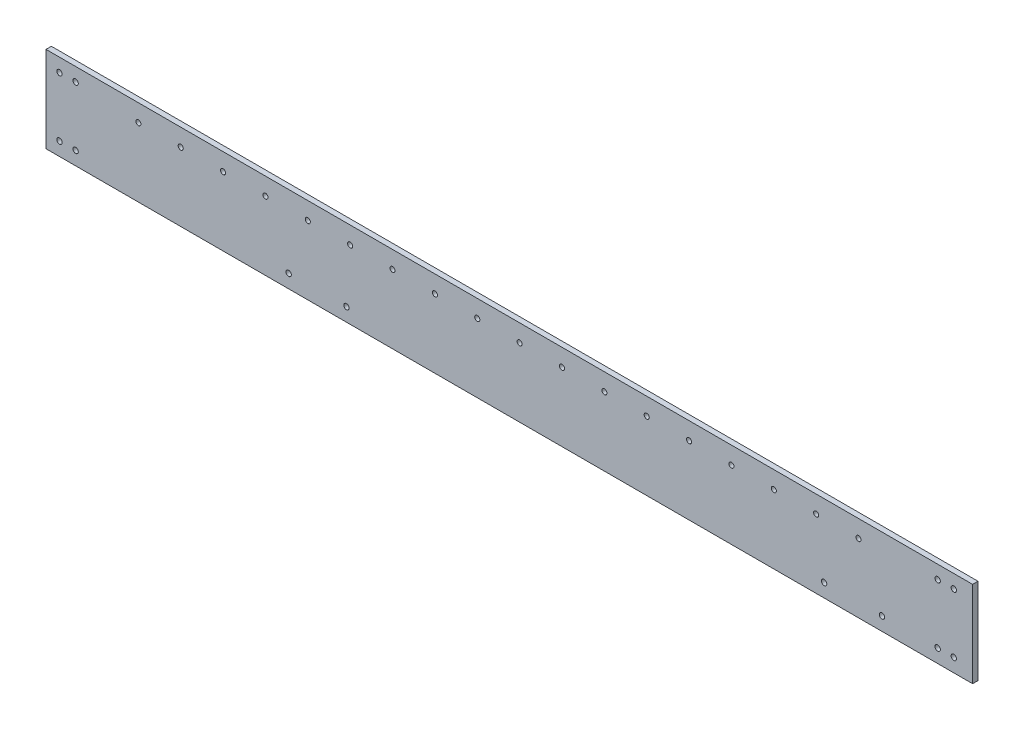
ISO-10303-21;
HEADER;
FILE_DESCRIPTION(('STEP AP214'),'2;1');
FILE_NAME('part.step','',(''),(''),'','','');
FILE_SCHEMA(('AUTOMOTIVE_DESIGN { 1 0 10303 214 1 1 1 1 }'));
ENDSEC;
DATA;
#1=APPLICATION_CONTEXT('core data for automotive mechanical design processes');
#2=APPLICATION_PROTOCOL_DEFINITION('international standard','automotive_design',2000,#1);
#3=PRODUCT_CONTEXT('',#1,'mechanical');
#4=PRODUCT('Part','Part','',(#3));
#5=PRODUCT_RELATED_PRODUCT_CATEGORY('part','',(#4));
#6=PRODUCT_DEFINITION_FORMATION('','',#4);
#7=PRODUCT_DEFINITION_CONTEXT('part definition',#1,'design');
#8=PRODUCT_DEFINITION('design','',#6,#7);
#9=PRODUCT_DEFINITION_SHAPE('','',#8);
#10=(LENGTH_UNIT() NAMED_UNIT(*) SI_UNIT(.MILLI.,.METRE.));
#11=(NAMED_UNIT(*) PLANE_ANGLE_UNIT() SI_UNIT($,.RADIAN.));
#12=(NAMED_UNIT(*) SI_UNIT($,.STERADIAN.) SOLID_ANGLE_UNIT());
#13=UNCERTAINTY_MEASURE_WITH_UNIT(LENGTH_MEASURE(1.E-05),#10,'distance_accuracy_value','');
#14=(GEOMETRIC_REPRESENTATION_CONTEXT(3) GLOBAL_UNCERTAINTY_ASSIGNED_CONTEXT((#13)) GLOBAL_UNIT_ASSIGNED_CONTEXT((#10,
#11,#12)) REPRESENTATION_CONTEXT('',''));
#15=CARTESIAN_POINT('',(0.,0.,0.));
#16=DIRECTION('',(0.,0.,1.));
#17=DIRECTION('',(1.,0.,0.));
#18=AXIS2_PLACEMENT_3D('',#15,#16,#17);
#19=CARTESIAN_POINT('',(546.825,50.8,0.));
#20=DIRECTION('',(0.,0.,1.));
#21=DIRECTION('',(0.,-1.,0.));
#22=AXIS2_PLACEMENT_3D('',#19,#20,#21);
#23=PLANE('',#22);
#24=CARTESIAN_POINT('',(254.5,40.575,0.));
#25=DIRECTION('',(0.,0.,1.));
#26=DIRECTION('',(1.,0.,0.));
#27=AXIS2_PLACEMENT_3D('',#24,#25,#26);
#28=CIRCLE('',#27,1.50000000000002);
#29=CARTESIAN_POINT('',(256.,40.575,0.));
#30=VERTEX_POINT('',#29);
#31=EDGE_CURVE('E167',#30,#30,#28,.T.);
#32=ORIENTED_EDGE('',*,*,#31,.T.);
#33=EDGE_LOOP('',(#32));
#34=FACE_BOUND('',#33,.T.);
#35=CARTESIAN_POINT('',(229.5,40.575,0.));
#36=DIRECTION('',(0.,0.,1.));
#37=DIRECTION('',(1.,0.,0.));
#38=AXIS2_PLACEMENT_3D('',#35,#36,#37);
#39=CIRCLE('',#38,1.5);
#40=CARTESIAN_POINT('',(231.,40.575,0.));
#41=VERTEX_POINT('',#40);
#42=EDGE_CURVE('E174',#41,#41,#39,.T.);
#43=ORIENTED_EDGE('',*,*,#42,.T.);
#44=EDGE_LOOP('',(#43));
#45=FACE_BOUND('',#44,.T.);
#46=CARTESIAN_POINT('',(204.5,40.575,0.));
#47=DIRECTION('',(0.,0.,1.));
#48=DIRECTION('',(1.,0.,0.));
#49=AXIS2_PLACEMENT_3D('',#46,#47,#48);
#50=CIRCLE('',#49,1.5);
#51=CARTESIAN_POINT('',(206.,40.575,0.));
#52=VERTEX_POINT('',#51);
#53=EDGE_CURVE('E180',#52,#52,#50,.T.);
#54=ORIENTED_EDGE('',*,*,#53,.T.);
#55=EDGE_LOOP('',(#54));
#56=FACE_BOUND('',#55,.T.);
#57=CARTESIAN_POINT('',(179.5,40.575,0.));
#58=DIRECTION('',(0.,0.,1.));
#59=DIRECTION('',(1.,0.,0.));
#60=AXIS2_PLACEMENT_3D('',#57,#58,#59);
#61=CIRCLE('',#60,1.5);
#62=CARTESIAN_POINT('',(181.,40.575,0.));
#63=VERTEX_POINT('',#62);
#64=EDGE_CURVE('E186',#63,#63,#61,.T.);
#65=ORIENTED_EDGE('',*,*,#64,.T.);
#66=EDGE_LOOP('',(#65));
#67=FACE_BOUND('',#66,.T.);
#68=CARTESIAN_POINT('',(154.5,40.575,0.));
#69=DIRECTION('',(0.,0.,1.));
#70=DIRECTION('',(1.,0.,0.));
#71=AXIS2_PLACEMENT_3D('',#68,#69,#70);
#72=CIRCLE('',#71,1.5);
#73=CARTESIAN_POINT('',(156.,40.575,0.));
#74=VERTEX_POINT('',#73);
#75=EDGE_CURVE('E192',#74,#74,#72,.T.);
#76=ORIENTED_EDGE('',*,*,#75,.T.);
#77=EDGE_LOOP('',(#76));
#78=FACE_BOUND('',#77,.T.);
#79=CARTESIAN_POINT('',(129.5,40.575,0.));
#80=DIRECTION('',(0.,0.,1.));
#81=DIRECTION('',(1.,0.,0.));
#82=AXIS2_PLACEMENT_3D('',#79,#80,#81);
#83=CIRCLE('',#82,1.5);
#84=CARTESIAN_POINT('',(131.,40.575,0.));
#85=VERTEX_POINT('',#84);
#86=EDGE_CURVE('E198',#85,#85,#83,.T.);
#87=ORIENTED_EDGE('',*,*,#86,.T.);
#88=EDGE_LOOP('',(#87));
#89=FACE_BOUND('',#88,.T.);
#90=CARTESIAN_POINT('',(104.5,40.575,0.));
#91=DIRECTION('',(0.,0.,1.));
#92=DIRECTION('',(1.,0.,0.));
#93=AXIS2_PLACEMENT_3D('',#90,#91,#92);
#94=CIRCLE('',#93,1.50000000000001);
#95=CARTESIAN_POINT('',(106.,40.575,0.));
#96=VERTEX_POINT('',#95);
#97=EDGE_CURVE('E204',#96,#96,#94,.T.);
#98=ORIENTED_EDGE('',*,*,#97,.T.);
#99=EDGE_LOOP('',(#98));
#100=FACE_BOUND('',#99,.T.);
#101=CARTESIAN_POINT('',(79.5,40.575,0.));
#102=DIRECTION('',(0.,0.,1.));
#103=DIRECTION('',(1.,0.,0.));
#104=AXIS2_PLACEMENT_3D('',#101,#102,#103);
#105=CIRCLE('',#104,1.5);
#106=CARTESIAN_POINT('',(81.,40.575,0.));
#107=VERTEX_POINT('',#106);
#108=EDGE_CURVE('E210',#107,#107,#105,.T.);
#109=ORIENTED_EDGE('',*,*,#108,.T.);
#110=EDGE_LOOP('',(#109));
#111=FACE_BOUND('',#110,.T.);
#112=CARTESIAN_POINT('',(535.7125,42.8625,0.));
#113=DIRECTION('',(0.,0.,1.));
#114=DIRECTION('',(1.,0.,0.));
#115=AXIS2_PLACEMENT_3D('',#112,#113,#114);
#116=CIRCLE('',#115,1.58750000000004);
#117=CARTESIAN_POINT('',(537.3,42.8625,0.));
#118=VERTEX_POINT('',#117);
#119=EDGE_CURVE('E138',#118,#118,#116,.T.);
#120=ORIENTED_EDGE('',*,*,#119,.T.);
#121=EDGE_LOOP('',(#120));
#122=FACE_BOUND('',#121,.T.);
#123=CARTESIAN_POINT('',(526.1875,42.8625,0.));
#124=DIRECTION('',(0.,0.,1.));
#125=DIRECTION('',(1.,0.,0.));
#126=AXIS2_PLACEMENT_3D('',#123,#124,#125);
#127=CIRCLE('',#126,1.58750000000004);
#128=CARTESIAN_POINT('',(527.775,42.8625,0.));
#129=VERTEX_POINT('',#128);
#130=EDGE_CURVE('E132',#129,#129,#127,.T.);
#131=ORIENTED_EDGE('',*,*,#130,.T.);
#132=EDGE_LOOP('',(#131));
#133=FACE_BOUND('',#132,.T.);
#134=CARTESIAN_POINT('',(17.4625,42.8625,0.));
#135=DIRECTION('',(0.,0.,1.));
#136=DIRECTION('',(1.,0.,0.));
#137=AXIS2_PLACEMENT_3D('',#134,#135,#136);
#138=CIRCLE('',#137,1.5875);
#139=CARTESIAN_POINT('',(19.05,42.8625,0.));
#140=VERTEX_POINT('',#139);
#141=EDGE_CURVE('E126',#140,#140,#138,.T.);
#142=ORIENTED_EDGE('',*,*,#141,.T.);
#143=EDGE_LOOP('',(#142));
#144=FACE_BOUND('',#143,.T.);
#145=CARTESIAN_POINT('',(7.93750000000004,7.9375,0.));
#146=DIRECTION('',(0.,0.,1.));
#147=DIRECTION('',(1.,0.,0.));
#148=AXIS2_PLACEMENT_3D('',#145,#146,#147);
#149=CIRCLE('',#148,1.5875);
#150=CARTESIAN_POINT('',(9.52500000000004,7.9375,0.));
#151=VERTEX_POINT('',#150);
#152=EDGE_CURVE('E119',#151,#151,#149,.T.);
#153=ORIENTED_EDGE('',*,*,#152,.T.);
#154=EDGE_LOOP('',(#153));
#155=FACE_BOUND('',#154,.T.);
#156=CARTESIAN_POINT('',(54.5,40.575,0.));
#157=DIRECTION('',(0.,0.,1.));
#158=DIRECTION('',(1.,0.,0.));
#159=AXIS2_PLACEMENT_3D('',#156,#157,#158);
#160=CIRCLE('',#159,1.5);
#161=CARTESIAN_POINT('',(56.,40.575,0.));
#162=VERTEX_POINT('',#161);
#163=EDGE_CURVE('E155',#162,#162,#160,.T.);
#164=ORIENTED_EDGE('',*,*,#163,.T.);
#165=EDGE_LOOP('',(#164));
#166=FACE_BOUND('',#165,.T.);
#167=CARTESIAN_POINT('',(535.7125,7.9375,0.));
#168=DIRECTION('',(0.,0.,1.));
#169=DIRECTION('',(1.,0.,0.));
#170=AXIS2_PLACEMENT_3D('',#167,#168,#169);
#171=CIRCLE('',#170,1.58750000000005);
#172=CARTESIAN_POINT('',(537.3,7.9375,0.));
#173=VERTEX_POINT('',#172);
#174=EDGE_CURVE('E162',#173,#173,#171,.T.);
#175=ORIENTED_EDGE('',*,*,#174,.T.);
#176=EDGE_LOOP('',(#175));
#177=FACE_BOUND('',#176,.T.);
#178=CARTESIAN_POINT('',(526.1875,7.9375,0.));
#179=DIRECTION('',(0.,0.,1.));
#180=DIRECTION('',(1.,0.,0.));
#181=AXIS2_PLACEMENT_3D('',#178,#179,#180);
#182=CIRCLE('',#181,1.58750000000005);
#183=CARTESIAN_POINT('',(527.775,7.9375,0.));
#184=VERTEX_POINT('',#183);
#185=EDGE_CURVE('E143',#184,#184,#182,.T.);
#186=ORIENTED_EDGE('',*,*,#185,.T.);
#187=EDGE_LOOP('',(#186));
#188=FACE_BOUND('',#187,.T.);
#189=CARTESIAN_POINT('',(17.4625,7.9375,0.));
#190=DIRECTION('',(0.,0.,1.));
#191=DIRECTION('',(1.,0.,0.));
#192=AXIS2_PLACEMENT_3D('',#189,#190,#191);
#193=CIRCLE('',#192,1.5875);
#194=CARTESIAN_POINT('',(19.05,7.9375,0.));
#195=VERTEX_POINT('',#194);
#196=EDGE_CURVE('E150',#195,#195,#193,.T.);
#197=ORIENTED_EDGE('',*,*,#196,.T.);
#198=EDGE_LOOP('',(#197));
#199=FACE_BOUND('',#198,.T.);
#200=CARTESIAN_POINT('',(143.1875,7.9375,0.));
#201=DIRECTION('',(0.,0.,1.));
#202=DIRECTION('',(1.,0.,0.));
#203=AXIS2_PLACEMENT_3D('',#200,#201,#202);
#204=CIRCLE('',#203,1.58749999999999);
#205=CARTESIAN_POINT('',(144.775,7.9375,0.));
#206=VERTEX_POINT('',#205);
#207=EDGE_CURVE('E275',#206,#206,#204,.T.);
#208=ORIENTED_EDGE('',*,*,#207,.T.);
#209=EDGE_LOOP('',(#208));
#210=FACE_BOUND('',#209,.T.);
#211=CARTESIAN_POINT('',(479.499999999999,40.575,0.));
#212=DIRECTION('',(0.,0.,1.));
#213=DIRECTION('',(1.,0.,0.));
#214=AXIS2_PLACEMENT_3D('',#211,#212,#213);
#215=CIRCLE('',#214,1.50000000000002);
#216=CARTESIAN_POINT('',(480.999999999999,40.575,0.));
#217=VERTEX_POINT('',#216);
#218=EDGE_CURVE('E282',#217,#217,#215,.T.);
#219=ORIENTED_EDGE('',*,*,#218,.T.);
#220=EDGE_LOOP('',(#219));
#221=FACE_BOUND('',#220,.T.);
#222=CARTESIAN_POINT('',(454.499999999999,40.575,0.));
#223=DIRECTION('',(0.,0.,1.));
#224=DIRECTION('',(1.,0.,0.));
#225=AXIS2_PLACEMENT_3D('',#222,#223,#224);
#226=CIRCLE('',#225,1.50000000000002);
#227=CARTESIAN_POINT('',(455.999999999999,40.575,0.));
#228=VERTEX_POINT('',#227);
#229=EDGE_CURVE('E263',#228,#228,#226,.T.);
#230=ORIENTED_EDGE('',*,*,#229,.T.);
#231=EDGE_LOOP('',(#230));
#232=FACE_BOUND('',#231,.T.);
#233=CARTESIAN_POINT('',(429.499999999999,40.575,0.));
#234=DIRECTION('',(0.,0.,1.));
#235=DIRECTION('',(1.,0.,0.));
#236=AXIS2_PLACEMENT_3D('',#233,#234,#235);
#237=CIRCLE('',#236,1.50000000000002);
#238=CARTESIAN_POINT('',(430.999999999999,40.575,0.));
#239=VERTEX_POINT('',#238);
#240=EDGE_CURVE('E270',#239,#239,#237,.T.);
#241=ORIENTED_EDGE('',*,*,#240,.T.);
#242=EDGE_LOOP('',(#241));
#243=FACE_BOUND('',#242,.T.);
#244=CARTESIAN_POINT('',(459.1875,7.9375,0.));
#245=DIRECTION('',(0.,0.,1.));
#246=DIRECTION('',(1.,0.,0.));
#247=AXIS2_PLACEMENT_3D('',#244,#245,#246);
#248=CIRCLE('',#247,1.58750000000004);
#249=CARTESIAN_POINT('',(460.775,7.9375,0.));
#250=VERTEX_POINT('',#249);
#251=EDGE_CURVE('E287',#250,#250,#248,.T.);
#252=ORIENTED_EDGE('',*,*,#251,.T.);
#253=EDGE_LOOP('',(#252));
#254=FACE_BOUND('',#253,.T.);
#255=CARTESIAN_POINT('',(279.5,40.575,0.));
#256=DIRECTION('',(0.,0.,1.));
#257=DIRECTION('',(1.,0.,0.));
#258=AXIS2_PLACEMENT_3D('',#255,#256,#257);
#259=CIRCLE('',#258,1.50000000000002);
#260=CARTESIAN_POINT('',(281.,40.575,0.));
#261=VERTEX_POINT('',#260);
#262=EDGE_CURVE('E234',#261,#261,#259,.T.);
#263=ORIENTED_EDGE('',*,*,#262,.T.);
#264=EDGE_LOOP('',(#263));
#265=FACE_BOUND('',#264,.T.);
#266=CARTESIAN_POINT('',(304.5,40.575,0.));
#267=DIRECTION('',(0.,0.,1.));
#268=DIRECTION('',(1.,0.,0.));
#269=AXIS2_PLACEMENT_3D('',#266,#267,#268);
#270=CIRCLE('',#269,1.50000000000002);
#271=CARTESIAN_POINT('',(306.,40.575,0.));
#272=VERTEX_POINT('',#271);
#273=EDGE_CURVE('E228',#272,#272,#270,.T.);
#274=ORIENTED_EDGE('',*,*,#273,.T.);
#275=EDGE_LOOP('',(#274));
#276=FACE_BOUND('',#275,.T.);
#277=CARTESIAN_POINT('',(329.499999999999,40.575,0.));
#278=DIRECTION('',(0.,0.,1.));
#279=DIRECTION('',(1.,0.,0.));
#280=AXIS2_PLACEMENT_3D('',#277,#278,#279);
#281=CIRCLE('',#280,1.50000000000002);
#282=CARTESIAN_POINT('',(331.,40.575,0.));
#283=VERTEX_POINT('',#282);
#284=EDGE_CURVE('E222',#283,#283,#281,.T.);
#285=ORIENTED_EDGE('',*,*,#284,.T.);
#286=EDGE_LOOP('',(#285));
#287=FACE_BOUND('',#286,.T.);
#288=CARTESIAN_POINT('',(354.499999999999,40.575,0.));
#289=DIRECTION('',(0.,0.,1.));
#290=DIRECTION('',(1.,0.,0.));
#291=AXIS2_PLACEMENT_3D('',#288,#289,#290);
#292=CIRCLE('',#291,1.50000000000002);
#293=CARTESIAN_POINT('',(355.999999999999,40.575,0.));
#294=VERTEX_POINT('',#293);
#295=EDGE_CURVE('E215',#294,#294,#292,.T.);
#296=ORIENTED_EDGE('',*,*,#295,.T.);
#297=EDGE_LOOP('',(#296));
#298=FACE_BOUND('',#297,.T.);
#299=CARTESIAN_POINT('',(404.499999999999,40.575,0.));
#300=DIRECTION('',(0.,0.,1.));
#301=DIRECTION('',(1.,0.,0.));
#302=AXIS2_PLACEMENT_3D('',#299,#300,#301);
#303=CIRCLE('',#302,1.50000000000002);
#304=CARTESIAN_POINT('',(405.999999999999,40.575,0.));
#305=VERTEX_POINT('',#304);
#306=EDGE_CURVE('E251',#305,#305,#303,.T.);
#307=ORIENTED_EDGE('',*,*,#306,.T.);
#308=EDGE_LOOP('',(#307));
#309=FACE_BOUND('',#308,.T.);
#310=CARTESIAN_POINT('',(177.3125,7.9375,0.));
#311=DIRECTION('',(0.,0.,1.));
#312=DIRECTION('',(1.,0.,0.));
#313=AXIS2_PLACEMENT_3D('',#310,#311,#312);
#314=CIRCLE('',#313,1.58749999999999);
#315=CARTESIAN_POINT('',(178.9,7.9375,0.));
#316=VERTEX_POINT('',#315);
#317=EDGE_CURVE('E258',#316,#316,#314,.T.);
#318=ORIENTED_EDGE('',*,*,#317,.T.);
#319=EDGE_LOOP('',(#318));
#320=FACE_BOUND('',#319,.T.);
#321=CARTESIAN_POINT('',(493.3125,7.9375,0.));
#322=DIRECTION('',(0.,0.,1.));
#323=DIRECTION('',(1.,0.,0.));
#324=AXIS2_PLACEMENT_3D('',#321,#322,#323);
#325=CIRCLE('',#324,1.58750000000004);
#326=CARTESIAN_POINT('',(494.9,7.9375,0.));
#327=VERTEX_POINT('',#326);
#328=EDGE_CURVE('E239',#327,#327,#325,.T.);
#329=ORIENTED_EDGE('',*,*,#328,.T.);
#330=EDGE_LOOP('',(#329));
#331=FACE_BOUND('',#330,.T.);
#332=CARTESIAN_POINT('',(379.499999999999,40.575,0.));
#333=DIRECTION('',(0.,0.,1.));
#334=DIRECTION('',(1.,0.,0.));
#335=AXIS2_PLACEMENT_3D('',#332,#333,#334);
#336=CIRCLE('',#335,1.50000000000002);
#337=CARTESIAN_POINT('',(380.999999999999,40.575,0.));
#338=VERTEX_POINT('',#337);
#339=EDGE_CURVE('E246',#338,#338,#336,.T.);
#340=ORIENTED_EDGE('',*,*,#339,.T.);
#341=EDGE_LOOP('',(#340));
#342=FACE_BOUND('',#341,.T.);
#343=CARTESIAN_POINT('',(7.93750000000004,42.8625,0.));
#344=DIRECTION('',(0.,0.,1.));
#345=DIRECTION('',(1.,0.,0.));
#346=AXIS2_PLACEMENT_3D('',#343,#344,#345);
#347=CIRCLE('',#346,1.5875);
#348=CARTESIAN_POINT('',(9.52500000000004,42.8625,0.));
#349=VERTEX_POINT('',#348);
#350=EDGE_CURVE('E102',#349,#349,#347,.T.);
#351=ORIENTED_EDGE('',*,*,#350,.T.);
#352=EDGE_LOOP('',(#351));
#353=FACE_BOUND('',#352,.T.);
#354=DIRECTION('',(0.,1.,0.));
#355=VECTOR('',#354,1.);
#356=CARTESIAN_POINT('',(0.,50.8,0.));
#357=LINE('',#356,#355);
#358=CARTESIAN_POINT('',(0.,0.,0.));
#359=VERTEX_POINT('',#358);
#360=CARTESIAN_POINT('',(0.,50.8,0.));
#361=VERTEX_POINT('',#360);
#362=EDGE_CURVE('E99',#359,#361,#357,.T.);
#363=ORIENTED_EDGE('',*,*,#362,.T.);
#364=DIRECTION('',(-1.,0.,0.));
#365=VECTOR('',#364,1.);
#366=CARTESIAN_POINT('',(546.825,50.8,0.));
#367=LINE('',#366,#365);
#368=CARTESIAN_POINT('',(546.825,50.8,0.));
#369=VERTEX_POINT('',#368);
#370=EDGE_CURVE('E11',#369,#361,#367,.T.);
#371=ORIENTED_EDGE('',*,*,#370,.F.);
#372=DIRECTION('',(0.,1.,0.));
#373=VECTOR('',#372,1.);
#374=CARTESIAN_POINT('',(546.825,50.8,0.));
#375=LINE('',#374,#373);
#376=CARTESIAN_POINT('',(546.825,0.,0.));
#377=VERTEX_POINT('',#376);
#378=EDGE_CURVE('E87',#377,#369,#375,.T.);
#379=ORIENTED_EDGE('',*,*,#378,.F.);
#380=DIRECTION('',(-1.,0.,0.));
#381=VECTOR('',#380,1.);
#382=CARTESIAN_POINT('',(546.825,0.,0.));
#383=LINE('',#382,#381);
#384=EDGE_CURVE('E95',#377,#359,#383,.T.);
#385=ORIENTED_EDGE('',*,*,#384,.T.);
#386=EDGE_LOOP('',(#363,#371,#379,#385));
#387=FACE_BOUND('',#386,.T.);
#388=ADVANCED_FACE('F36',(#34,#45,#56,#67,#78,#89,#100,#111,#122,#133,#144,#155,#166,#177,#188,
#199,#210,#221,#232,#243,#254,#265,#276,#287,#298,#309,#320,#331,#342,#353,#387),#23,.F.);
#389=CARTESIAN_POINT('',(546.825,50.8,3.17500000000001));
#390=DIRECTION('',(0.,-1.,0.));
#391=DIRECTION('',(0.,0.,-1.));
#392=AXIS2_PLACEMENT_3D('',#389,#390,#391);
#393=PLANE('',#392);
#394=DIRECTION('',(0.,0.,1.));
#395=VECTOR('',#394,1.);
#396=CARTESIAN_POINT('',(0.,50.8,3.17500000000001));
#397=LINE('',#396,#395);
#398=CARTESIAN_POINT('',(0.,50.8,3.17500000000001));
#399=VERTEX_POINT('',#398);
#400=EDGE_CURVE('E91',#361,#399,#397,.T.);
#401=ORIENTED_EDGE('',*,*,#400,.T.);
#402=DIRECTION('',(-1.,0.,0.));
#403=VECTOR('',#402,1.);
#404=CARTESIAN_POINT('',(546.825,50.8,3.17500000000001));
#405=LINE('',#404,#403);
#406=CARTESIAN_POINT('',(546.825,50.8,3.17500000000001));
#407=VERTEX_POINT('',#406);
#408=EDGE_CURVE('E44',#407,#399,#405,.T.);
#409=ORIENTED_EDGE('',*,*,#408,.F.);
#410=DIRECTION('',(0.,0.,1.));
#411=VECTOR('',#410,1.);
#412=CARTESIAN_POINT('',(546.825,50.8,3.17500000000001));
#413=LINE('',#412,#411);
#414=EDGE_CURVE('E82',#369,#407,#413,.T.);
#415=ORIENTED_EDGE('',*,*,#414,.F.);
#416=ORIENTED_EDGE('',*,*,#370,.T.);
#417=EDGE_LOOP('',(#401,#409,#415,#416));
#418=FACE_BOUND('',#417,.T.);
#419=ADVANCED_FACE('F90',(#418),#393,.F.);
#420=CARTESIAN_POINT('',(546.825,0.,3.175));
#421=DIRECTION('',(0.,0.,-1.));
#422=DIRECTION('',(0.,1.,0.));
#423=AXIS2_PLACEMENT_3D('',#420,#421,#422);
#424=PLANE('',#423);
#425=CARTESIAN_POINT('',(254.5,40.575,3.175));
#426=DIRECTION('',(0.,0.,1.));
#427=DIRECTION('',(1.,0.,0.));
#428=AXIS2_PLACEMENT_3D('',#425,#426,#427);
#429=CIRCLE('',#428,1.50000000000002);
#430=CARTESIAN_POINT('',(256.,40.575,3.175));
#431=VERTEX_POINT('',#430);
#432=EDGE_CURVE('E170',#431,#431,#429,.T.);
#433=ORIENTED_EDGE('',*,*,#432,.F.);
#434=EDGE_LOOP('',(#433));
#435=FACE_BOUND('',#434,.T.);
#436=CARTESIAN_POINT('',(229.5,40.575,3.175));
#437=DIRECTION('',(0.,0.,1.));
#438=DIRECTION('',(1.,0.,0.));
#439=AXIS2_PLACEMENT_3D('',#436,#437,#438);
#440=CIRCLE('',#439,1.5);
#441=CARTESIAN_POINT('',(231.,40.575,3.175));
#442=VERTEX_POINT('',#441);
#443=EDGE_CURVE('E177',#442,#442,#440,.T.);
#444=ORIENTED_EDGE('',*,*,#443,.F.);
#445=EDGE_LOOP('',(#444));
#446=FACE_BOUND('',#445,.T.);
#447=CARTESIAN_POINT('',(204.5,40.575,3.175));
#448=DIRECTION('',(0.,0.,1.));
#449=DIRECTION('',(1.,0.,0.));
#450=AXIS2_PLACEMENT_3D('',#447,#448,#449);
#451=CIRCLE('',#450,1.5);
#452=CARTESIAN_POINT('',(206.,40.575,3.175));
#453=VERTEX_POINT('',#452);
#454=EDGE_CURVE('E183',#453,#453,#451,.T.);
#455=ORIENTED_EDGE('',*,*,#454,.F.);
#456=EDGE_LOOP('',(#455));
#457=FACE_BOUND('',#456,.T.);
#458=CARTESIAN_POINT('',(179.5,40.575,3.175));
#459=DIRECTION('',(0.,0.,1.));
#460=DIRECTION('',(1.,0.,0.));
#461=AXIS2_PLACEMENT_3D('',#458,#459,#460);
#462=CIRCLE('',#461,1.5);
#463=CARTESIAN_POINT('',(181.,40.575,3.175));
#464=VERTEX_POINT('',#463);
#465=EDGE_CURVE('E189',#464,#464,#462,.T.);
#466=ORIENTED_EDGE('',*,*,#465,.F.);
#467=EDGE_LOOP('',(#466));
#468=FACE_BOUND('',#467,.T.);
#469=CARTESIAN_POINT('',(154.5,40.575,3.175));
#470=DIRECTION('',(0.,0.,1.));
#471=DIRECTION('',(1.,0.,0.));
#472=AXIS2_PLACEMENT_3D('',#469,#470,#471);
#473=CIRCLE('',#472,1.5);
#474=CARTESIAN_POINT('',(156.,40.575,3.175));
#475=VERTEX_POINT('',#474);
#476=EDGE_CURVE('E195',#475,#475,#473,.T.);
#477=ORIENTED_EDGE('',*,*,#476,.F.);
#478=EDGE_LOOP('',(#477));
#479=FACE_BOUND('',#478,.T.);
#480=CARTESIAN_POINT('',(129.5,40.575,3.175));
#481=DIRECTION('',(0.,0.,1.));
#482=DIRECTION('',(1.,0.,0.));
#483=AXIS2_PLACEMENT_3D('',#480,#481,#482);
#484=CIRCLE('',#483,1.5);
#485=CARTESIAN_POINT('',(131.,40.575,3.175));
#486=VERTEX_POINT('',#485);
#487=EDGE_CURVE('E201',#486,#486,#484,.T.);
#488=ORIENTED_EDGE('',*,*,#487,.F.);
#489=EDGE_LOOP('',(#488));
#490=FACE_BOUND('',#489,.T.);
#491=CARTESIAN_POINT('',(104.5,40.575,3.175));
#492=DIRECTION('',(0.,0.,1.));
#493=DIRECTION('',(1.,0.,0.));
#494=AXIS2_PLACEMENT_3D('',#491,#492,#493);
#495=CIRCLE('',#494,1.50000000000001);
#496=CARTESIAN_POINT('',(106.,40.575,3.175));
#497=VERTEX_POINT('',#496);
#498=EDGE_CURVE('E207',#497,#497,#495,.T.);
#499=ORIENTED_EDGE('',*,*,#498,.F.);
#500=EDGE_LOOP('',(#499));
#501=FACE_BOUND('',#500,.T.);
#502=CARTESIAN_POINT('',(79.5,40.575,3.175));
#503=DIRECTION('',(0.,0.,1.));
#504=DIRECTION('',(1.,0.,0.));
#505=AXIS2_PLACEMENT_3D('',#502,#503,#504);
#506=CIRCLE('',#505,1.5);
#507=CARTESIAN_POINT('',(81.,40.575,3.175));
#508=VERTEX_POINT('',#507);
#509=EDGE_CURVE('E159',#508,#508,#506,.T.);
#510=ORIENTED_EDGE('',*,*,#509,.F.);
#511=EDGE_LOOP('',(#510));
#512=FACE_BOUND('',#511,.T.);
#513=CARTESIAN_POINT('',(535.7125,42.8625,3.175));
#514=DIRECTION('',(0.,0.,1.));
#515=DIRECTION('',(1.,0.,0.));
#516=AXIS2_PLACEMENT_3D('',#513,#514,#515);
#517=CIRCLE('',#516,1.58750000000004);
#518=CARTESIAN_POINT('',(537.3,42.8625,3.175));
#519=VERTEX_POINT('',#518);
#520=EDGE_CURVE('E116',#519,#519,#517,.T.);
#521=ORIENTED_EDGE('',*,*,#520,.F.);
#522=EDGE_LOOP('',(#521));
#523=FACE_BOUND('',#522,.T.);
#524=CARTESIAN_POINT('',(526.1875,42.8625,3.175));
#525=DIRECTION('',(0.,0.,1.));
#526=DIRECTION('',(1.,0.,0.));
#527=AXIS2_PLACEMENT_3D('',#524,#525,#526);
#528=CIRCLE('',#527,1.58750000000004);
#529=CARTESIAN_POINT('',(527.775,42.8625,3.175));
#530=VERTEX_POINT('',#529);
#531=EDGE_CURVE('E135',#530,#530,#528,.T.);
#532=ORIENTED_EDGE('',*,*,#531,.F.);
#533=EDGE_LOOP('',(#532));
#534=FACE_BOUND('',#533,.T.);
#535=CARTESIAN_POINT('',(17.4625,42.8625,3.175));
#536=DIRECTION('',(0.,0.,1.));
#537=DIRECTION('',(1.,0.,0.));
#538=AXIS2_PLACEMENT_3D('',#535,#536,#537);
#539=CIRCLE('',#538,1.5875);
#540=CARTESIAN_POINT('',(19.05,42.8625,3.175));
#541=VERTEX_POINT('',#540);
#542=EDGE_CURVE('E129',#541,#541,#539,.T.);
#543=ORIENTED_EDGE('',*,*,#542,.F.);
#544=EDGE_LOOP('',(#543));
#545=FACE_BOUND('',#544,.T.);
#546=CARTESIAN_POINT('',(7.93750000000004,7.9375,3.175));
#547=DIRECTION('',(0.,0.,1.));
#548=DIRECTION('',(1.,0.,0.));
#549=AXIS2_PLACEMENT_3D('',#546,#547,#548);
#550=CIRCLE('',#549,1.5875);
#551=CARTESIAN_POINT('',(9.52500000000004,7.9375,3.175));
#552=VERTEX_POINT('',#551);
#553=EDGE_CURVE('E122',#552,#552,#550,.T.);
#554=ORIENTED_EDGE('',*,*,#553,.F.);
#555=EDGE_LOOP('',(#554));
#556=FACE_BOUND('',#555,.T.);
#557=CARTESIAN_POINT('',(54.5,40.575,3.175));
#558=DIRECTION('',(0.,0.,1.));
#559=DIRECTION('',(1.,0.,0.));
#560=AXIS2_PLACEMENT_3D('',#557,#558,#559);
#561=CIRCLE('',#560,1.5);
#562=CARTESIAN_POINT('',(56.,40.575,3.175));
#563=VERTEX_POINT('',#562);
#564=EDGE_CURVE('E158',#563,#563,#561,.T.);
#565=ORIENTED_EDGE('',*,*,#564,.F.);
#566=EDGE_LOOP('',(#565));
#567=FACE_BOUND('',#566,.T.);
#568=CARTESIAN_POINT('',(535.7125,7.9375,3.175));
#569=DIRECTION('',(0.,0.,1.));
#570=DIRECTION('',(1.,0.,0.));
#571=AXIS2_PLACEMENT_3D('',#568,#569,#570);
#572=CIRCLE('',#571,1.58750000000005);
#573=CARTESIAN_POINT('',(537.3,7.9375,3.175));
#574=VERTEX_POINT('',#573);
#575=EDGE_CURVE('E147',#574,#574,#572,.T.);
#576=ORIENTED_EDGE('',*,*,#575,.F.);
#577=EDGE_LOOP('',(#576));
#578=FACE_BOUND('',#577,.T.);
#579=CARTESIAN_POINT('',(526.1875,7.9375,3.175));
#580=DIRECTION('',(0.,0.,1.));
#581=DIRECTION('',(1.,0.,0.));
#582=AXIS2_PLACEMENT_3D('',#579,#580,#581);
#583=CIRCLE('',#582,1.58750000000005);
#584=CARTESIAN_POINT('',(527.775,7.9375,3.175));
#585=VERTEX_POINT('',#584);
#586=EDGE_CURVE('E146',#585,#585,#583,.T.);
#587=ORIENTED_EDGE('',*,*,#586,.F.);
#588=EDGE_LOOP('',(#587));
#589=FACE_BOUND('',#588,.T.);
#590=CARTESIAN_POINT('',(17.4625,7.9375,3.175));
#591=DIRECTION('',(0.,0.,1.));
#592=DIRECTION('',(1.,0.,0.));
#593=AXIS2_PLACEMENT_3D('',#590,#591,#592);
#594=CIRCLE('',#593,1.5875);
#595=CARTESIAN_POINT('',(19.05,7.9375,3.175));
#596=VERTEX_POINT('',#595);
#597=EDGE_CURVE('E123',#596,#596,#594,.T.);
#598=ORIENTED_EDGE('',*,*,#597,.F.);
#599=EDGE_LOOP('',(#598));
#600=FACE_BOUND('',#599,.T.);
#601=CARTESIAN_POINT('',(143.1875,7.9375,3.175));
#602=DIRECTION('',(0.,0.,1.));
#603=DIRECTION('',(1.,0.,0.));
#604=AXIS2_PLACEMENT_3D('',#601,#602,#603);
#605=CIRCLE('',#604,1.58749999999999);
#606=CARTESIAN_POINT('',(144.775,7.9375,3.175));
#607=VERTEX_POINT('',#606);
#608=EDGE_CURVE('E278',#607,#607,#605,.T.);
#609=ORIENTED_EDGE('',*,*,#608,.F.);
#610=EDGE_LOOP('',(#609));
#611=FACE_BOUND('',#610,.T.);
#612=CARTESIAN_POINT('',(479.499999999999,40.575,3.175));
#613=DIRECTION('',(0.,0.,1.));
#614=DIRECTION('',(1.,0.,0.));
#615=AXIS2_PLACEMENT_3D('',#612,#613,#614);
#616=CIRCLE('',#615,1.50000000000002);
#617=CARTESIAN_POINT('',(480.999999999999,40.575,3.175));
#618=VERTEX_POINT('',#617);
#619=EDGE_CURVE('E267',#618,#618,#616,.T.);
#620=ORIENTED_EDGE('',*,*,#619,.F.);
#621=EDGE_LOOP('',(#620));
#622=FACE_BOUND('',#621,.T.);
#623=CARTESIAN_POINT('',(454.499999999999,40.575,3.175));
#624=DIRECTION('',(0.,0.,1.));
#625=DIRECTION('',(1.,0.,0.));
#626=AXIS2_PLACEMENT_3D('',#623,#624,#625);
#627=CIRCLE('',#626,1.50000000000002);
#628=CARTESIAN_POINT('',(455.999999999999,40.575,3.175));
#629=VERTEX_POINT('',#628);
#630=EDGE_CURVE('E266',#629,#629,#627,.T.);
#631=ORIENTED_EDGE('',*,*,#630,.F.);
#632=EDGE_LOOP('',(#631));
#633=FACE_BOUND('',#632,.T.);
#634=CARTESIAN_POINT('',(429.499999999999,40.575,3.175));
#635=DIRECTION('',(0.,0.,1.));
#636=DIRECTION('',(1.,0.,0.));
#637=AXIS2_PLACEMENT_3D('',#634,#635,#636);
#638=CIRCLE('',#637,1.50000000000002);
#639=CARTESIAN_POINT('',(430.999999999999,40.575,3.175));
#640=VERTEX_POINT('',#639);
#641=EDGE_CURVE('E255',#640,#640,#638,.T.);
#642=ORIENTED_EDGE('',*,*,#641,.F.);
#643=EDGE_LOOP('',(#642));
#644=FACE_BOUND('',#643,.T.);
#645=CARTESIAN_POINT('',(459.1875,7.9375,3.175));
#646=DIRECTION('',(0.,0.,1.));
#647=DIRECTION('',(1.,0.,0.));
#648=AXIS2_PLACEMENT_3D('',#645,#646,#647);
#649=CIRCLE('',#648,1.58750000000004);
#650=CARTESIAN_POINT('',(460.775,7.9375,3.175));
#651=VERTEX_POINT('',#650);
#652=EDGE_CURVE('E279',#651,#651,#649,.T.);
#653=ORIENTED_EDGE('',*,*,#652,.F.);
#654=EDGE_LOOP('',(#653));
#655=FACE_BOUND('',#654,.T.);
#656=CARTESIAN_POINT('',(279.5,40.575,3.175));
#657=DIRECTION('',(0.,0.,1.));
#658=DIRECTION('',(1.,0.,0.));
#659=AXIS2_PLACEMENT_3D('',#656,#657,#658);
#660=CIRCLE('',#659,1.50000000000002);
#661=CARTESIAN_POINT('',(281.,40.575,3.175));
#662=VERTEX_POINT('',#661);
#663=EDGE_CURVE('E171',#662,#662,#660,.T.);
#664=ORIENTED_EDGE('',*,*,#663,.F.);
#665=EDGE_LOOP('',(#664));
#666=FACE_BOUND('',#665,.T.);
#667=CARTESIAN_POINT('',(304.5,40.575,3.175));
#668=DIRECTION('',(0.,0.,1.));
#669=DIRECTION('',(1.,0.,0.));
#670=AXIS2_PLACEMENT_3D('',#667,#668,#669);
#671=CIRCLE('',#670,1.50000000000002);
#672=CARTESIAN_POINT('',(306.,40.575,3.175));
#673=VERTEX_POINT('',#672);
#674=EDGE_CURVE('E231',#673,#673,#671,.T.);
#675=ORIENTED_EDGE('',*,*,#674,.F.);
#676=EDGE_LOOP('',(#675));
#677=FACE_BOUND('',#676,.T.);
#678=CARTESIAN_POINT('',(329.499999999999,40.575,3.175));
#679=DIRECTION('',(0.,0.,1.));
#680=DIRECTION('',(1.,0.,0.));
#681=AXIS2_PLACEMENT_3D('',#678,#679,#680);
#682=CIRCLE('',#681,1.50000000000002);
#683=CARTESIAN_POINT('',(331.,40.575,3.175));
#684=VERTEX_POINT('',#683);
#685=EDGE_CURVE('E225',#684,#684,#682,.T.);
#686=ORIENTED_EDGE('',*,*,#685,.F.);
#687=EDGE_LOOP('',(#686));
#688=FACE_BOUND('',#687,.T.);
#689=CARTESIAN_POINT('',(354.499999999999,40.575,3.175));
#690=DIRECTION('',(0.,0.,1.));
#691=DIRECTION('',(1.,0.,0.));
#692=AXIS2_PLACEMENT_3D('',#689,#690,#691);
#693=CIRCLE('',#692,1.50000000000002);
#694=CARTESIAN_POINT('',(355.999999999999,40.575,3.175));
#695=VERTEX_POINT('',#694);
#696=EDGE_CURVE('E218',#695,#695,#693,.T.);
#697=ORIENTED_EDGE('',*,*,#696,.F.);
#698=EDGE_LOOP('',(#697));
#699=FACE_BOUND('',#698,.T.);
#700=CARTESIAN_POINT('',(404.499999999999,40.575,3.175));
#701=DIRECTION('',(0.,0.,1.));
#702=DIRECTION('',(1.,0.,0.));
#703=AXIS2_PLACEMENT_3D('',#700,#701,#702);
#704=CIRCLE('',#703,1.50000000000002);
#705=CARTESIAN_POINT('',(405.999999999999,40.575,3.175));
#706=VERTEX_POINT('',#705);
#707=EDGE_CURVE('E254',#706,#706,#704,.T.);
#708=ORIENTED_EDGE('',*,*,#707,.F.);
#709=EDGE_LOOP('',(#708));
#710=FACE_BOUND('',#709,.T.);
#711=CARTESIAN_POINT('',(177.3125,7.9375,3.175));
#712=DIRECTION('',(0.,0.,1.));
#713=DIRECTION('',(1.,0.,0.));
#714=AXIS2_PLACEMENT_3D('',#711,#712,#713);
#715=CIRCLE('',#714,1.58749999999999);
#716=CARTESIAN_POINT('',(178.9,7.9375,3.175));
#717=VERTEX_POINT('',#716);
#718=EDGE_CURVE('E243',#717,#717,#715,.T.);
#719=ORIENTED_EDGE('',*,*,#718,.F.);
#720=EDGE_LOOP('',(#719));
#721=FACE_BOUND('',#720,.T.);
#722=CARTESIAN_POINT('',(493.3125,7.9375,3.175));
#723=DIRECTION('',(0.,0.,1.));
#724=DIRECTION('',(1.,0.,0.));
#725=AXIS2_PLACEMENT_3D('',#722,#723,#724);
#726=CIRCLE('',#725,1.58750000000004);
#727=CARTESIAN_POINT('',(494.9,7.9375,3.175));
#728=VERTEX_POINT('',#727);
#729=EDGE_CURVE('E242',#728,#728,#726,.T.);
#730=ORIENTED_EDGE('',*,*,#729,.F.);
#731=EDGE_LOOP('',(#730));
#732=FACE_BOUND('',#731,.T.);
#733=CARTESIAN_POINT('',(379.499999999999,40.575,3.175));
#734=DIRECTION('',(0.,0.,1.));
#735=DIRECTION('',(1.,0.,0.));
#736=AXIS2_PLACEMENT_3D('',#733,#734,#735);
#737=CIRCLE('',#736,1.50000000000002);
#738=CARTESIAN_POINT('',(380.999999999999,40.575,3.175));
#739=VERTEX_POINT('',#738);
#740=EDGE_CURVE('E219',#739,#739,#737,.T.);
#741=ORIENTED_EDGE('',*,*,#740,.F.);
#742=EDGE_LOOP('',(#741));
#743=FACE_BOUND('',#742,.T.);
#744=CARTESIAN_POINT('',(7.93750000000004,42.8625,3.175));
#745=DIRECTION('',(0.,0.,1.));
#746=DIRECTION('',(1.,0.,0.));
#747=AXIS2_PLACEMENT_3D('',#744,#745,#746);
#748=CIRCLE('',#747,1.5875);
#749=CARTESIAN_POINT('',(9.52500000000004,42.8625,3.175));
#750=VERTEX_POINT('',#749);
#751=EDGE_CURVE('E113',#750,#750,#748,.T.);
#752=ORIENTED_EDGE('',*,*,#751,.F.);
#753=EDGE_LOOP('',(#752));
#754=FACE_BOUND('',#753,.T.);
#755=DIRECTION('',(0.,-1.,0.));
#756=VECTOR('',#755,1.);
#757=CARTESIAN_POINT('',(0.,0.,3.175));
#758=LINE('',#757,#756);
#759=CARTESIAN_POINT('',(0.,0.,3.175));
#760=VERTEX_POINT('',#759);
#761=EDGE_CURVE('E69',#399,#760,#758,.T.);
#762=ORIENTED_EDGE('',*,*,#761,.T.);
#763=DIRECTION('',(-1.,0.,0.));
#764=VECTOR('',#763,1.);
#765=CARTESIAN_POINT('',(546.825,0.,3.175));
#766=LINE('',#765,#764);
#767=CARTESIAN_POINT('',(546.825,0.,3.175));
#768=VERTEX_POINT('',#767);
#769=EDGE_CURVE('E92',#768,#760,#766,.T.);
#770=ORIENTED_EDGE('',*,*,#769,.F.);
#771=DIRECTION('',(0.,-1.,0.));
#772=VECTOR('',#771,1.);
#773=CARTESIAN_POINT('',(546.825,0.,3.175));
#774=LINE('',#773,#772);
#775=EDGE_CURVE('E85',#407,#768,#774,.T.);
#776=ORIENTED_EDGE('',*,*,#775,.F.);
#777=ORIENTED_EDGE('',*,*,#408,.T.);
#778=EDGE_LOOP('',(#762,#770,#776,#777));
#779=FACE_BOUND('',#778,.T.);
#780=ADVANCED_FACE('F93',(#435,#446,#457,#468,#479,#490,#501,#512,#523,#534,#545,#556,#567,#578,
#589,#600,#611,#622,#633,#644,#655,#666,#677,#688,#699,#710,#721,#732,#743,#754,#779),#424,.F.);
#781=CARTESIAN_POINT('',(546.825,0.,0.));
#782=DIRECTION('',(0.,1.,0.));
#783=DIRECTION('',(0.,0.,1.));
#784=AXIS2_PLACEMENT_3D('',#781,#782,#783);
#785=PLANE('',#784);
#786=DIRECTION('',(0.,0.,-1.));
#787=VECTOR('',#786,1.);
#788=CARTESIAN_POINT('',(0.,0.,0.));
#789=LINE('',#788,#787);
#790=EDGE_CURVE('E75',#760,#359,#789,.T.);
#791=ORIENTED_EDGE('',*,*,#790,.T.);
#792=ORIENTED_EDGE('',*,*,#384,.F.);
#793=DIRECTION('',(0.,0.,-1.));
#794=VECTOR('',#793,1.);
#795=CARTESIAN_POINT('',(546.825,0.,0.));
#796=LINE('',#795,#794);
#797=EDGE_CURVE('E52',#768,#377,#796,.T.);
#798=ORIENTED_EDGE('',*,*,#797,.F.);
#799=ORIENTED_EDGE('',*,*,#769,.T.);
#800=EDGE_LOOP('',(#791,#792,#798,#799));
#801=FACE_BOUND('',#800,.T.);
#802=ADVANCED_FACE('F107',(#801),#785,.F.);
#803=CARTESIAN_POINT('',(546.825,0.,0.));
#804=DIRECTION('',(-1.,0.,0.));
#805=DIRECTION('',(0.,0.,1.));
#806=AXIS2_PLACEMENT_3D('',#803,#804,#805);
#807=PLANE('',#806);
#808=ORIENTED_EDGE('',*,*,#378,.T.);
#809=ORIENTED_EDGE('',*,*,#414,.T.);
#810=ORIENTED_EDGE('',*,*,#775,.T.);
#811=ORIENTED_EDGE('',*,*,#797,.T.);
#812=EDGE_LOOP('',(#808,#809,#810,#811));
#813=FACE_BOUND('',#812,.T.);
#814=ADVANCED_FACE('F83',(#813),#807,.F.);
#815=CARTESIAN_POINT('',(0.,0.,0.));
#816=DIRECTION('',(-1.,0.,0.));
#817=DIRECTION('',(0.,0.,1.));
#818=AXIS2_PLACEMENT_3D('',#815,#816,#817);
#819=PLANE('',#818);
#820=ORIENTED_EDGE('',*,*,#362,.F.);
#821=ORIENTED_EDGE('',*,*,#790,.F.);
#822=ORIENTED_EDGE('',*,*,#761,.F.);
#823=ORIENTED_EDGE('',*,*,#400,.F.);
#824=EDGE_LOOP('',(#820,#821,#822,#823));
#825=FACE_BOUND('',#824,.T.);
#826=ADVANCED_FACE('F110',(#825),#819,.T.);
#827=CARTESIAN_POINT('',(7.93750000000004,42.8625,0.));
#828=DIRECTION('',(0.,0.,1.));
#829=DIRECTION('',(1.,0.,0.));
#830=AXIS2_PLACEMENT_3D('',#827,#828,#829);
#831=CYLINDRICAL_SURFACE('',#830,1.5875);
#832=ORIENTED_EDGE('',*,*,#350,.F.);
#833=EDGE_LOOP('',(#832));
#834=FACE_BOUND('',#833,.T.);
#835=ORIENTED_EDGE('',*,*,#751,.T.);
#836=EDGE_LOOP('',(#835));
#837=FACE_BOUND('',#836,.T.);
#838=ADVANCED_FACE('F317',(#834,#837),#831,.F.);
#839=CARTESIAN_POINT('',(379.499999999999,40.575,0.));
#840=DIRECTION('',(0.,0.,1.));
#841=DIRECTION('',(1.,0.,0.));
#842=AXIS2_PLACEMENT_3D('',#839,#840,#841);
#843=CYLINDRICAL_SURFACE('',#842,1.50000000000002);
#844=ORIENTED_EDGE('',*,*,#339,.F.);
#845=EDGE_LOOP('',(#844));
#846=FACE_BOUND('',#845,.T.);
#847=ORIENTED_EDGE('',*,*,#740,.T.);
#848=EDGE_LOOP('',(#847));
#849=FACE_BOUND('',#848,.T.);
#850=ADVANCED_FACE('F319',(#846,#849),#843,.F.);
#851=CARTESIAN_POINT('',(493.3125,7.9375,0.));
#852=DIRECTION('',(0.,0.,1.));
#853=DIRECTION('',(1.,0.,0.));
#854=AXIS2_PLACEMENT_3D('',#851,#852,#853);
#855=CYLINDRICAL_SURFACE('',#854,1.58750000000004);
#856=ORIENTED_EDGE('',*,*,#328,.F.);
#857=EDGE_LOOP('',(#856));
#858=FACE_BOUND('',#857,.T.);
#859=ORIENTED_EDGE('',*,*,#729,.T.);
#860=EDGE_LOOP('',(#859));
#861=FACE_BOUND('',#860,.T.);
#862=ADVANCED_FACE('F326',(#858,#861),#855,.F.);
#863=CARTESIAN_POINT('',(177.3125,7.9375,0.));
#864=DIRECTION('',(0.,0.,1.));
#865=DIRECTION('',(1.,0.,0.));
#866=AXIS2_PLACEMENT_3D('',#863,#864,#865);
#867=CYLINDRICAL_SURFACE('',#866,1.58749999999999);
#868=ORIENTED_EDGE('',*,*,#317,.F.);
#869=EDGE_LOOP('',(#868));
#870=FACE_BOUND('',#869,.T.);
#871=ORIENTED_EDGE('',*,*,#718,.T.);
#872=EDGE_LOOP('',(#871));
#873=FACE_BOUND('',#872,.T.);
#874=ADVANCED_FACE('F400',(#870,#873),#867,.F.);
#875=CARTESIAN_POINT('',(404.499999999999,40.575,0.));
#876=DIRECTION('',(0.,0.,1.));
#877=DIRECTION('',(1.,0.,0.));
#878=AXIS2_PLACEMENT_3D('',#875,#876,#877);
#879=CYLINDRICAL_SURFACE('',#878,1.50000000000002);
#880=ORIENTED_EDGE('',*,*,#306,.F.);
#881=EDGE_LOOP('',(#880));
#882=FACE_BOUND('',#881,.T.);
#883=ORIENTED_EDGE('',*,*,#707,.T.);
#884=EDGE_LOOP('',(#883));
#885=FACE_BOUND('',#884,.T.);
#886=ADVANCED_FACE('F405',(#882,#885),#879,.F.);
#887=CARTESIAN_POINT('',(354.499999999999,40.575,0.));
#888=DIRECTION('',(0.,0.,1.));
#889=DIRECTION('',(1.,0.,0.));
#890=AXIS2_PLACEMENT_3D('',#887,#888,#889);
#891=CYLINDRICAL_SURFACE('',#890,1.50000000000002);
#892=ORIENTED_EDGE('',*,*,#295,.F.);
#893=EDGE_LOOP('',(#892));
#894=FACE_BOUND('',#893,.T.);
#895=ORIENTED_EDGE('',*,*,#696,.T.);
#896=EDGE_LOOP('',(#895));
#897=FACE_BOUND('',#896,.T.);
#898=ADVANCED_FACE('F421',(#894,#897),#891,.F.);
#899=CARTESIAN_POINT('',(329.499999999999,40.575,0.));
#900=DIRECTION('',(0.,0.,1.));
#901=DIRECTION('',(1.,0.,0.));
#902=AXIS2_PLACEMENT_3D('',#899,#900,#901);
#903=CYLINDRICAL_SURFACE('',#902,1.50000000000002);
#904=ORIENTED_EDGE('',*,*,#284,.F.);
#905=EDGE_LOOP('',(#904));
#906=FACE_BOUND('',#905,.T.);
#907=ORIENTED_EDGE('',*,*,#685,.T.);
#908=EDGE_LOOP('',(#907));
#909=FACE_BOUND('',#908,.T.);
#910=ADVANCED_FACE('F417',(#906,#909),#903,.F.);
#911=CARTESIAN_POINT('',(304.5,40.575,0.));
#912=DIRECTION('',(0.,0.,1.));
#913=DIRECTION('',(1.,0.,0.));
#914=AXIS2_PLACEMENT_3D('',#911,#912,#913);
#915=CYLINDRICAL_SURFACE('',#914,1.50000000000002);
#916=ORIENTED_EDGE('',*,*,#273,.F.);
#917=EDGE_LOOP('',(#916));
#918=FACE_BOUND('',#917,.T.);
#919=ORIENTED_EDGE('',*,*,#674,.T.);
#920=EDGE_LOOP('',(#919));
#921=FACE_BOUND('',#920,.T.);
#922=ADVANCED_FACE('F413',(#918,#921),#915,.F.);
#923=CARTESIAN_POINT('',(279.5,40.575,0.));
#924=DIRECTION('',(0.,0.,1.));
#925=DIRECTION('',(1.,0.,0.));
#926=AXIS2_PLACEMENT_3D('',#923,#924,#925);
#927=CYLINDRICAL_SURFACE('',#926,1.50000000000002);
#928=ORIENTED_EDGE('',*,*,#262,.F.);
#929=EDGE_LOOP('',(#928));
#930=FACE_BOUND('',#929,.T.);
#931=ORIENTED_EDGE('',*,*,#663,.T.);
#932=EDGE_LOOP('',(#931));
#933=FACE_BOUND('',#932,.T.);
#934=ADVANCED_FACE('F410',(#930,#933),#927,.F.);
#935=CARTESIAN_POINT('',(459.1875,7.9375,0.));
#936=DIRECTION('',(0.,0.,1.));
#937=DIRECTION('',(1.,0.,0.));
#938=AXIS2_PLACEMENT_3D('',#935,#936,#937);
#939=CYLINDRICAL_SURFACE('',#938,1.58750000000004);
#940=ORIENTED_EDGE('',*,*,#251,.F.);
#941=EDGE_LOOP('',(#940));
#942=FACE_BOUND('',#941,.T.);
#943=ORIENTED_EDGE('',*,*,#652,.T.);
#944=EDGE_LOOP('',(#943));
#945=FACE_BOUND('',#944,.T.);
#946=ADVANCED_FACE('F293',(#942,#945),#939,.F.);
#947=CARTESIAN_POINT('',(429.499999999999,40.575,0.));
#948=DIRECTION('',(0.,0.,1.));
#949=DIRECTION('',(1.,0.,0.));
#950=AXIS2_PLACEMENT_3D('',#947,#948,#949);
#951=CYLINDRICAL_SURFACE('',#950,1.50000000000002);
#952=ORIENTED_EDGE('',*,*,#240,.F.);
#953=EDGE_LOOP('',(#952));
#954=FACE_BOUND('',#953,.T.);
#955=ORIENTED_EDGE('',*,*,#641,.T.);
#956=EDGE_LOOP('',(#955));
#957=FACE_BOUND('',#956,.T.);
#958=ADVANCED_FACE('F511',(#954,#957),#951,.F.);
#959=CARTESIAN_POINT('',(454.499999999999,40.575,0.));
#960=DIRECTION('',(0.,0.,1.));
#961=DIRECTION('',(1.,0.,0.));
#962=AXIS2_PLACEMENT_3D('',#959,#960,#961);
#963=CYLINDRICAL_SURFACE('',#962,1.50000000000002);
#964=ORIENTED_EDGE('',*,*,#229,.F.);
#965=EDGE_LOOP('',(#964));
#966=FACE_BOUND('',#965,.T.);
#967=ORIENTED_EDGE('',*,*,#630,.T.);
#968=EDGE_LOOP('',(#967));
#969=FACE_BOUND('',#968,.T.);
#970=ADVANCED_FACE('F513',(#966,#969),#963,.F.);
#971=CARTESIAN_POINT('',(479.499999999999,40.575,0.));
#972=DIRECTION('',(0.,0.,1.));
#973=DIRECTION('',(1.,0.,0.));
#974=AXIS2_PLACEMENT_3D('',#971,#972,#973);
#975=CYLINDRICAL_SURFACE('',#974,1.50000000000002);
#976=ORIENTED_EDGE('',*,*,#218,.F.);
#977=EDGE_LOOP('',(#976));
#978=FACE_BOUND('',#977,.T.);
#979=ORIENTED_EDGE('',*,*,#619,.T.);
#980=EDGE_LOOP('',(#979));
#981=FACE_BOUND('',#980,.T.);
#982=ADVANCED_FACE('F520',(#978,#981),#975,.F.);
#983=CARTESIAN_POINT('',(143.1875,7.9375,0.));
#984=DIRECTION('',(0.,0.,1.));
#985=DIRECTION('',(1.,0.,0.));
#986=AXIS2_PLACEMENT_3D('',#983,#984,#985);
#987=CYLINDRICAL_SURFACE('',#986,1.58749999999999);
#988=ORIENTED_EDGE('',*,*,#207,.F.);
#989=EDGE_LOOP('',(#988));
#990=FACE_BOUND('',#989,.T.);
#991=ORIENTED_EDGE('',*,*,#608,.T.);
#992=EDGE_LOOP('',(#991));
#993=FACE_BOUND('',#992,.T.);
#994=ADVANCED_FACE('F472',(#990,#993),#987,.F.);
#995=CARTESIAN_POINT('',(17.4625,7.9375,0.));
#996=DIRECTION('',(0.,0.,1.));
#997=DIRECTION('',(1.,0.,0.));
#998=AXIS2_PLACEMENT_3D('',#995,#996,#997);
#999=CYLINDRICAL_SURFACE('',#998,1.5875);
#1000=ORIENTED_EDGE('',*,*,#196,.F.);
#1001=EDGE_LOOP('',(#1000));
#1002=FACE_BOUND('',#1001,.T.);
#1003=ORIENTED_EDGE('',*,*,#597,.T.);
#1004=EDGE_LOOP('',(#1003));
#1005=FACE_BOUND('',#1004,.T.);
#1006=ADVANCED_FACE('F469',(#1002,#1005),#999,.F.);
#1007=CARTESIAN_POINT('',(526.1875,7.9375,0.));
#1008=DIRECTION('',(0.,0.,1.));
#1009=DIRECTION('',(1.,0.,0.));
#1010=AXIS2_PLACEMENT_3D('',#1007,#1008,#1009);
#1011=CYLINDRICAL_SURFACE('',#1010,1.58750000000005);
#1012=ORIENTED_EDGE('',*,*,#185,.F.);
#1013=EDGE_LOOP('',(#1012));
#1014=FACE_BOUND('',#1013,.T.);
#1015=ORIENTED_EDGE('',*,*,#586,.T.);
#1016=EDGE_LOOP('',(#1015));
#1017=FACE_BOUND('',#1016,.T.);
#1018=ADVANCED_FACE('F463',(#1014,#1017),#1011,.F.);
#1019=CARTESIAN_POINT('',(535.7125,7.9375,0.));
#1020=DIRECTION('',(0.,0.,1.));
#1021=DIRECTION('',(1.,0.,0.));
#1022=AXIS2_PLACEMENT_3D('',#1019,#1020,#1021);
#1023=CYLINDRICAL_SURFACE('',#1022,1.58750000000005);
#1024=ORIENTED_EDGE('',*,*,#174,.F.);
#1025=EDGE_LOOP('',(#1024));
#1026=FACE_BOUND('',#1025,.T.);
#1027=ORIENTED_EDGE('',*,*,#575,.T.);
#1028=EDGE_LOOP('',(#1027));
#1029=FACE_BOUND('',#1028,.T.);
#1030=ADVANCED_FACE('F459',(#1026,#1029),#1023,.F.);
#1031=CARTESIAN_POINT('',(54.5,40.575,0.));
#1032=DIRECTION('',(0.,0.,1.));
#1033=DIRECTION('',(1.,0.,0.));
#1034=AXIS2_PLACEMENT_3D('',#1031,#1032,#1033);
#1035=CYLINDRICAL_SURFACE('',#1034,1.5);
#1036=ORIENTED_EDGE('',*,*,#163,.F.);
#1037=EDGE_LOOP('',(#1036));
#1038=FACE_BOUND('',#1037,.T.);
#1039=ORIENTED_EDGE('',*,*,#564,.T.);
#1040=EDGE_LOOP('',(#1039));
#1041=FACE_BOUND('',#1040,.T.);
#1042=ADVANCED_FACE('F462',(#1038,#1041),#1035,.F.);
#1043=CARTESIAN_POINT('',(7.93750000000004,7.9375,0.));
#1044=DIRECTION('',(0.,0.,1.));
#1045=DIRECTION('',(1.,0.,0.));
#1046=AXIS2_PLACEMENT_3D('',#1043,#1044,#1045);
#1047=CYLINDRICAL_SURFACE('',#1046,1.5875);
#1048=ORIENTED_EDGE('',*,*,#152,.F.);
#1049=EDGE_LOOP('',(#1048));
#1050=FACE_BOUND('',#1049,.T.);
#1051=ORIENTED_EDGE('',*,*,#553,.T.);
#1052=EDGE_LOOP('',(#1051));
#1053=FACE_BOUND('',#1052,.T.);
#1054=ADVANCED_FACE('F467',(#1050,#1053),#1047,.F.);
#1055=CARTESIAN_POINT('',(17.4625,42.8625,0.));
#1056=DIRECTION('',(0.,0.,1.));
#1057=DIRECTION('',(1.,0.,0.));
#1058=AXIS2_PLACEMENT_3D('',#1055,#1056,#1057);
#1059=CYLINDRICAL_SURFACE('',#1058,1.5875);
#1060=ORIENTED_EDGE('',*,*,#141,.F.);
#1061=EDGE_LOOP('',(#1060));
#1062=FACE_BOUND('',#1061,.T.);
#1063=ORIENTED_EDGE('',*,*,#542,.T.);
#1064=EDGE_LOOP('',(#1063));
#1065=FACE_BOUND('',#1064,.T.);
#1066=ADVANCED_FACE('F483',(#1062,#1065),#1059,.F.);
#1067=CARTESIAN_POINT('',(526.1875,42.8625,0.));
#1068=DIRECTION('',(0.,0.,1.));
#1069=DIRECTION('',(1.,0.,0.));
#1070=AXIS2_PLACEMENT_3D('',#1067,#1068,#1069);
#1071=CYLINDRICAL_SURFACE('',#1070,1.58750000000004);
#1072=ORIENTED_EDGE('',*,*,#130,.F.);
#1073=EDGE_LOOP('',(#1072));
#1074=FACE_BOUND('',#1073,.T.);
#1075=ORIENTED_EDGE('',*,*,#531,.T.);
#1076=EDGE_LOOP('',(#1075));
#1077=FACE_BOUND('',#1076,.T.);
#1078=ADVANCED_FACE('F479',(#1074,#1077),#1071,.F.);
#1079=CARTESIAN_POINT('',(535.7125,42.8625,0.));
#1080=DIRECTION('',(0.,0.,1.));
#1081=DIRECTION('',(1.,0.,0.));
#1082=AXIS2_PLACEMENT_3D('',#1079,#1080,#1081);
#1083=CYLINDRICAL_SURFACE('',#1082,1.58750000000004);
#1084=ORIENTED_EDGE('',*,*,#119,.F.);
#1085=EDGE_LOOP('',(#1084));
#1086=FACE_BOUND('',#1085,.T.);
#1087=ORIENTED_EDGE('',*,*,#520,.T.);
#1088=EDGE_LOOP('',(#1087));
#1089=FACE_BOUND('',#1088,.T.);
#1090=ADVANCED_FACE('F430',(#1086,#1089),#1083,.F.);
#1091=CARTESIAN_POINT('',(79.5,40.575,0.));
#1092=DIRECTION('',(0.,0.,1.));
#1093=DIRECTION('',(1.,0.,0.));
#1094=AXIS2_PLACEMENT_3D('',#1091,#1092,#1093);
#1095=CYLINDRICAL_SURFACE('',#1094,1.5);
#1096=ORIENTED_EDGE('',*,*,#108,.F.);
#1097=EDGE_LOOP('',(#1096));
#1098=FACE_BOUND('',#1097,.T.);
#1099=ORIENTED_EDGE('',*,*,#509,.T.);
#1100=EDGE_LOOP('',(#1099));
#1101=FACE_BOUND('',#1100,.T.);
#1102=ADVANCED_FACE('F426',(#1098,#1101),#1095,.F.);
#1103=CARTESIAN_POINT('',(104.5,40.575,0.));
#1104=DIRECTION('',(0.,0.,1.));
#1105=DIRECTION('',(1.,0.,0.));
#1106=AXIS2_PLACEMENT_3D('',#1103,#1104,#1105);
#1107=CYLINDRICAL_SURFACE('',#1106,1.50000000000001);
#1108=ORIENTED_EDGE('',*,*,#97,.F.);
#1109=EDGE_LOOP('',(#1108));
#1110=FACE_BOUND('',#1109,.T.);
#1111=ORIENTED_EDGE('',*,*,#498,.T.);
#1112=EDGE_LOOP('',(#1111));
#1113=FACE_BOUND('',#1112,.T.);
#1114=ADVANCED_FACE('F429',(#1110,#1113),#1107,.F.);
#1115=CARTESIAN_POINT('',(129.5,40.575,0.));
#1116=DIRECTION('',(0.,0.,1.));
#1117=DIRECTION('',(1.,0.,0.));
#1118=AXIS2_PLACEMENT_3D('',#1115,#1116,#1117);
#1119=CYLINDRICAL_SURFACE('',#1118,1.5);
#1120=ORIENTED_EDGE('',*,*,#86,.F.);
#1121=EDGE_LOOP('',(#1120));
#1122=FACE_BOUND('',#1121,.T.);
#1123=ORIENTED_EDGE('',*,*,#487,.T.);
#1124=EDGE_LOOP('',(#1123));
#1125=FACE_BOUND('',#1124,.T.);
#1126=ADVANCED_FACE('F434',(#1122,#1125),#1119,.F.);
#1127=CARTESIAN_POINT('',(154.5,40.575,0.));
#1128=DIRECTION('',(0.,0.,1.));
#1129=DIRECTION('',(1.,0.,0.));
#1130=AXIS2_PLACEMENT_3D('',#1127,#1128,#1129);
#1131=CYLINDRICAL_SURFACE('',#1130,1.5);
#1132=ORIENTED_EDGE('',*,*,#75,.F.);
#1133=EDGE_LOOP('',(#1132));
#1134=FACE_BOUND('',#1133,.T.);
#1135=ORIENTED_EDGE('',*,*,#476,.T.);
#1136=EDGE_LOOP('',(#1135));
#1137=FACE_BOUND('',#1136,.T.);
#1138=ADVANCED_FACE('F438',(#1134,#1137),#1131,.F.);
#1139=CARTESIAN_POINT('',(179.5,40.575,0.));
#1140=DIRECTION('',(0.,0.,1.));
#1141=DIRECTION('',(1.,0.,0.));
#1142=AXIS2_PLACEMENT_3D('',#1139,#1140,#1141);
#1143=CYLINDRICAL_SURFACE('',#1142,1.5);
#1144=ORIENTED_EDGE('',*,*,#64,.F.);
#1145=EDGE_LOOP('',(#1144));
#1146=FACE_BOUND('',#1145,.T.);
#1147=ORIENTED_EDGE('',*,*,#465,.T.);
#1148=EDGE_LOOP('',(#1147));
#1149=FACE_BOUND('',#1148,.T.);
#1150=ADVANCED_FACE('F442',(#1146,#1149),#1143,.F.);
#1151=CARTESIAN_POINT('',(204.5,40.575,0.));
#1152=DIRECTION('',(0.,0.,1.));
#1153=DIRECTION('',(1.,0.,0.));
#1154=AXIS2_PLACEMENT_3D('',#1151,#1152,#1153);
#1155=CYLINDRICAL_SURFACE('',#1154,1.5);
#1156=ORIENTED_EDGE('',*,*,#53,.F.);
#1157=EDGE_LOOP('',(#1156));
#1158=FACE_BOUND('',#1157,.T.);
#1159=ORIENTED_EDGE('',*,*,#454,.T.);
#1160=EDGE_LOOP('',(#1159));
#1161=FACE_BOUND('',#1160,.T.);
#1162=ADVANCED_FACE('F446',(#1158,#1161),#1155,.F.);
#1163=CARTESIAN_POINT('',(229.5,40.575,0.));
#1164=DIRECTION('',(0.,0.,1.));
#1165=DIRECTION('',(1.,0.,0.));
#1166=AXIS2_PLACEMENT_3D('',#1163,#1164,#1165);
#1167=CYLINDRICAL_SURFACE('',#1166,1.5);
#1168=ORIENTED_EDGE('',*,*,#42,.F.);
#1169=EDGE_LOOP('',(#1168));
#1170=FACE_BOUND('',#1169,.T.);
#1171=ORIENTED_EDGE('',*,*,#443,.T.);
#1172=EDGE_LOOP('',(#1171));
#1173=FACE_BOUND('',#1172,.T.);
#1174=ADVANCED_FACE('F450',(#1170,#1173),#1167,.F.);
#1175=CARTESIAN_POINT('',(254.5,40.575,0.));
#1176=DIRECTION('',(0.,0.,1.));
#1177=DIRECTION('',(1.,0.,0.));
#1178=AXIS2_PLACEMENT_3D('',#1175,#1176,#1177);
#1179=CYLINDRICAL_SURFACE('',#1178,1.50000000000002);
#1180=ORIENTED_EDGE('',*,*,#31,.F.);
#1181=EDGE_LOOP('',(#1180));
#1182=FACE_BOUND('',#1181,.T.);
#1183=ORIENTED_EDGE('',*,*,#432,.T.);
#1184=EDGE_LOOP('',(#1183));
#1185=FACE_BOUND('',#1184,.T.);
#1186=ADVANCED_FACE('F454',(#1182,#1185),#1179,.F.);
#1187=CLOSED_SHELL('',(#388,#419,#780,#802,#814,#826,#838,#850,#862,#874,#886,#898,#910,#922,
#934,#946,#958,#970,#982,#994,#1006,#1018,#1030,#1042,#1054,#1066,#1078,#1090,#1102,#1114,#1126,
#1138,#1150,#1162,#1174,#1186));
#1188=MANIFOLD_SOLID_BREP('B2',#1187);
#1189=ADVANCED_BREP_SHAPE_REPRESENTATION('',(#18,#1188),#14);
#1190=SHAPE_DEFINITION_REPRESENTATION(#9,#1189);
ENDSEC;
END-ISO-10303-21;
